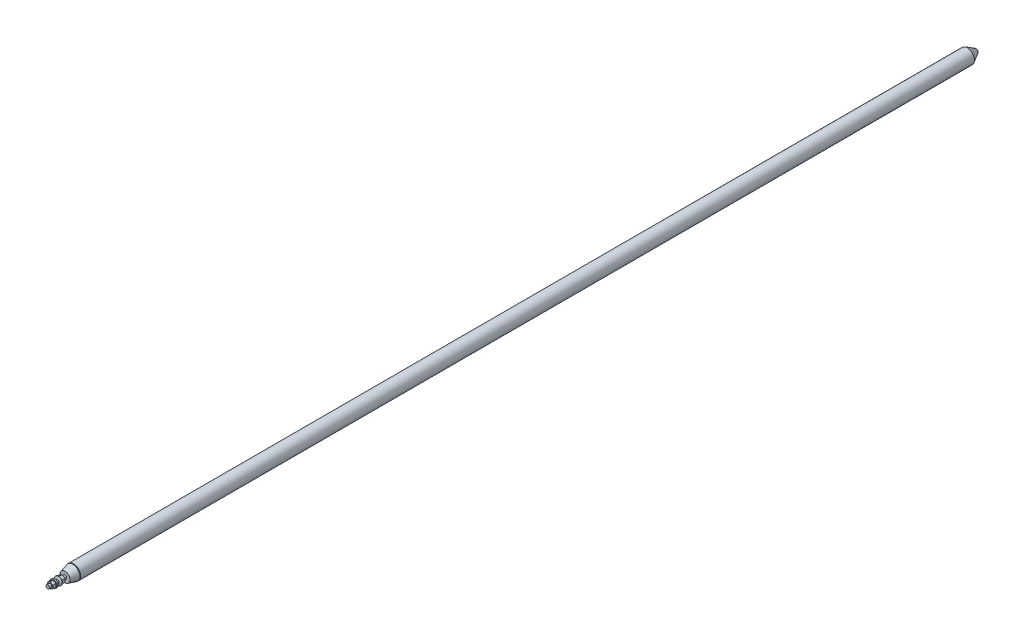
ISO-10303-21;
HEADER;
FILE_DESCRIPTION(('STEP AP214'),'2;1');
FILE_NAME('part.step','',(''),(''),'','','');
FILE_SCHEMA(('AUTOMOTIVE_DESIGN { 1 0 10303 214 1 1 1 1 }'));
ENDSEC;
DATA;
#1=APPLICATION_CONTEXT('core data for automotive mechanical design processes');
#2=APPLICATION_PROTOCOL_DEFINITION('international standard','automotive_design',2000,#1);
#3=PRODUCT_CONTEXT('',#1,'mechanical');
#4=PRODUCT('Part','Part','',(#3));
#5=PRODUCT_RELATED_PRODUCT_CATEGORY('part','',(#4));
#6=PRODUCT_DEFINITION_FORMATION('','',#4);
#7=PRODUCT_DEFINITION_CONTEXT('part definition',#1,'design');
#8=PRODUCT_DEFINITION('design','',#6,#7);
#9=PRODUCT_DEFINITION_SHAPE('','',#8);
#10=(LENGTH_UNIT() NAMED_UNIT(*) SI_UNIT(.MILLI.,.METRE.));
#11=(NAMED_UNIT(*) PLANE_ANGLE_UNIT() SI_UNIT($,.RADIAN.));
#12=(NAMED_UNIT(*) SI_UNIT($,.STERADIAN.) SOLID_ANGLE_UNIT());
#13=UNCERTAINTY_MEASURE_WITH_UNIT(LENGTH_MEASURE(1.E-05),#10,'distance_accuracy_value','');
#14=(GEOMETRIC_REPRESENTATION_CONTEXT(3) GLOBAL_UNCERTAINTY_ASSIGNED_CONTEXT((#13)) GLOBAL_UNIT_ASSIGNED_CONTEXT((#10,
#11,#12)) REPRESENTATION_CONTEXT('',''));
#15=CARTESIAN_POINT('',(0.,0.,0.));
#16=DIRECTION('',(0.,0.,1.));
#17=DIRECTION('',(1.,0.,0.));
#18=AXIS2_PLACEMENT_3D('',#15,#16,#17);
#19=CARTESIAN_POINT('',(0.,16.6751,52.1089983991226));
#20=DIRECTION('',(0.,0.,1.));
#21=DIRECTION('',(1.,0.,0.));
#22=AXIS2_PLACEMENT_3D('',#19,#20,#21);
#23=PLANE('',#22);
#24=CARTESIAN_POINT('',(0.,0.,52.1089983991226));
#25=DIRECTION('',(0.,0.,-1.));
#26=DIRECTION('',(-1.,0.,0.));
#27=AXIS2_PLACEMENT_3D('',#24,#25,#26);
#28=CIRCLE('',#27,16.6751);
#29=CARTESIAN_POINT('',(-16.6751,0.,52.1089983991226));
#30=VERTEX_POINT('',#29);
#31=EDGE_CURVE('E149',#30,#30,#28,.T.);
#32=ORIENTED_EDGE('',*,*,#31,.F.);
#33=EDGE_LOOP('',(#32));
#34=FACE_BOUND('',#33,.T.);
#35=DIRECTION('',(0.866025403784438,0.5,0.));
#36=VECTOR('',#35,1.);
#37=CARTESIAN_POINT('',(0.,-13.7554856334967,52.1089983991226));
#38=LINE('',#37,#36);
#39=CARTESIAN_POINT('',(0.,-13.7554856334967,52.1089983991226));
#40=VERTEX_POINT('',#39);
#41=CARTESIAN_POINT('',(11.9126,-6.87774281674833,52.1089983991226));
#42=VERTEX_POINT('',#41);
#43=EDGE_CURVE('E626',#40,#42,#38,.T.);
#44=ORIENTED_EDGE('',*,*,#43,.F.);
#45=DIRECTION('',(0.866025403784439,-0.499999999999999,0.));
#46=VECTOR('',#45,1.);
#47=CARTESIAN_POINT('',(-11.9126,-6.87774281674834,52.1089983991226));
#48=LINE('',#47,#46);
#49=CARTESIAN_POINT('',(-11.9126,-6.87774281674834,52.1089983991226));
#50=VERTEX_POINT('',#49);
#51=EDGE_CURVE('E147',#50,#40,#48,.T.);
#52=ORIENTED_EDGE('',*,*,#51,.F.);
#53=DIRECTION('',(0.,-1.,0.));
#54=VECTOR('',#53,1.);
#55=CARTESIAN_POINT('',(-11.9126,6.87774281674833,52.1089983991226));
#56=LINE('',#55,#54);
#57=CARTESIAN_POINT('',(-11.9126,6.87774281674833,52.1089983991226));
#58=VERTEX_POINT('',#57);
#59=EDGE_CURVE('E143',#58,#50,#56,.T.);
#60=ORIENTED_EDGE('',*,*,#59,.F.);
#61=DIRECTION('',(-0.866025403784439,-0.5,0.));
#62=VECTOR('',#61,1.);
#63=CARTESIAN_POINT('',(0.,13.7554856334967,52.1089983991226));
#64=LINE('',#63,#62);
#65=CARTESIAN_POINT('',(0.,13.7554856334967,52.1089983991226));
#66=VERTEX_POINT('',#65);
#67=EDGE_CURVE('E622',#66,#58,#64,.T.);
#68=ORIENTED_EDGE('',*,*,#67,.F.);
#69=DIRECTION('',(-0.866025403784439,0.5,0.));
#70=VECTOR('',#69,1.);
#71=CARTESIAN_POINT('',(11.9126,6.87774281674833,52.1089983991226));
#72=LINE('',#71,#70);
#73=CARTESIAN_POINT('',(11.9126,6.87774281674833,52.1089983991226));
#74=VERTEX_POINT('',#73);
#75=EDGE_CURVE('E634',#74,#66,#72,.T.);
#76=ORIENTED_EDGE('',*,*,#75,.F.);
#77=DIRECTION('',(0.,1.,0.));
#78=VECTOR('',#77,1.);
#79=CARTESIAN_POINT('',(11.9126,-6.87774281674833,52.1089983991226));
#80=LINE('',#79,#78);
#81=EDGE_CURVE('E628',#42,#74,#80,.T.);
#82=ORIENTED_EDGE('',*,*,#81,.F.);
#83=EDGE_LOOP('',(#44,#52,#60,#68,#76,#82));
#84=FACE_BOUND('',#83,.T.);
#85=ADVANCED_FACE('F33',(#34,#84),#23,.T.);
#86=CARTESIAN_POINT('',(0.,0.,0.));
#87=DIRECTION('',(0.,0.,-1.));
#88=DIRECTION('',(-1.,0.,0.));
#89=AXIS2_PLACEMENT_3D('',#86,#87,#88);
#90=CYLINDRICAL_SURFACE('',#89,7.93749999999999);
#91=CARTESIAN_POINT('',(0.,0.,46.2923983991226));
#92=DIRECTION('',(0.,0.,-1.));
#93=DIRECTION('',(-1.,0.,0.));
#94=AXIS2_PLACEMENT_3D('',#91,#92,#93);
#95=CIRCLE('',#94,7.93749999999999);
#96=CARTESIAN_POINT('',(-7.93749999999999,0.,46.2923983991226));
#97=VERTEX_POINT('',#96);
#98=EDGE_CURVE('E42',#97,#97,#95,.F.);
#99=ORIENTED_EDGE('',*,*,#98,.F.);
#100=EDGE_LOOP('',(#99));
#101=FACE_BOUND('',#100,.T.);
#102=CARTESIAN_POINT('',(0.,0.,33.5923983991226));
#103=DIRECTION('',(0.,0.,-1.));
#104=DIRECTION('',(-1.,0.,0.));
#105=AXIS2_PLACEMENT_3D('',#102,#103,#104);
#106=CIRCLE('',#105,7.93749999999999);
#107=CARTESIAN_POINT('',(0.,7.93749999999996,33.5923983991227));
#108=VERTEX_POINT('',#107);
#109=EDGE_CURVE('E236',#108,#108,#106,.T.);
#110=ORIENTED_EDGE('',*,*,#109,.F.);
#111=EDGE_LOOP('',(#110));
#112=FACE_BOUND('',#111,.T.);
#113=ADVANCED_FACE('F248',(#101,#112),#90,.T.);
#114=CARTESIAN_POINT('',(0.,0.,0.));
#115=DIRECTION('',(0.,0.,-1.));
#116=DIRECTION('',(-1.,0.,0.));
#117=AXIS2_PLACEMENT_3D('',#114,#115,#116);
#118=CIRCLE('',#117,7.93749999999999);
#119=CARTESIAN_POINT('',(-7.93749999999999,0.,0.));
#120=VERTEX_POINT('',#119);
#121=EDGE_CURVE('E224',#120,#120,#118,.T.);
#122=ORIENTED_EDGE('',*,*,#121,.F.);
#123=EDGE_LOOP('',(#122));
#124=FACE_BOUND('',#123,.T.);
#125=CARTESIAN_POINT('',(0.,0.,12.690475));
#126=DIRECTION('',(0.,0.,1.));
#127=DIRECTION('',(1.,0.,0.));
#128=AXIS2_PLACEMENT_3D('',#125,#126,#127);
#129=CIRCLE('',#128,7.93749999999999);
#130=CARTESIAN_POINT('',(7.93749999999999,0.,12.690475));
#131=VERTEX_POINT('',#130);
#132=EDGE_CURVE('E201',#131,#131,#129,.F.);
#133=ORIENTED_EDGE('',*,*,#132,.T.);
#134=EDGE_LOOP('',(#133));
#135=FACE_BOUND('',#134,.T.);
#136=ADVANCED_FACE('F251',(#124,#135),#90,.T.);
#137=CARTESIAN_POINT('',(0.,0.,-38.1));
#138=DIRECTION('',(0.,0.,1.));
#139=DIRECTION('',(1.,0.,0.));
#140=AXIS2_PLACEMENT_3D('',#137,#138,#139);
#141=CONICAL_SURFACE('',#140,28.575,0.780728808749583);
#142=CARTESIAN_POINT('',(0.,0.,-34.8952102827305));
#143=DIRECTION('',(0.,0.,-1.));
#144=DIRECTION('',(-1.,0.,0.));
#145=AXIS2_PLACEMENT_3D('',#142,#143,#144);
#146=CIRCLE('',#145,31.75);
#147=CARTESIAN_POINT('',(-31.75,0.,-34.8952102827305));
#148=VERTEX_POINT('',#147);
#149=EDGE_CURVE('E230',#148,#148,#146,.T.);
#150=ORIENTED_EDGE('',*,*,#149,.T.);
#151=EDGE_LOOP('',(#150));
#152=FACE_BOUND('',#151,.T.);
#153=CARTESIAN_POINT('',(0.,0.,-38.1));
#154=DIRECTION('',(0.,0.,-1.));
#155=DIRECTION('',(-1.,0.,0.));
#156=AXIS2_PLACEMENT_3D('',#153,#154,#155);
#157=CIRCLE('',#156,28.575);
#158=CARTESIAN_POINT('',(-28.575,0.,-38.1));
#159=VERTEX_POINT('',#158);
#160=EDGE_CURVE('E233',#159,#159,#157,.T.);
#161=ORIENTED_EDGE('',*,*,#160,.F.);
#162=EDGE_LOOP('',(#161));
#163=FACE_BOUND('',#162,.T.);
#164=ADVANCED_FACE('F454',(#152,#163),#141,.T.);
#165=CARTESIAN_POINT('',(0.,0.,-34.8952102827305));
#166=DIRECTION('',(0.,0.,-1.));
#167=DIRECTION('',(-1.,0.,0.));
#168=AXIS2_PLACEMENT_3D('',#165,#166,#167);
#169=CONICAL_SURFACE('',#168,31.75,0.266468742447018);
#170=CARTESIAN_POINT('',(0.,0.,0.));
#171=DIRECTION('',(0.,0.,-1.));
#172=DIRECTION('',(-1.,0.,0.));
#173=AXIS2_PLACEMENT_3D('',#170,#171,#172);
#174=CIRCLE('',#173,22.225);
#175=CARTESIAN_POINT('',(-22.225,0.,0.));
#176=VERTEX_POINT('',#175);
#177=EDGE_CURVE('E227',#176,#176,#174,.T.);
#178=ORIENTED_EDGE('',*,*,#177,.T.);
#179=EDGE_LOOP('',(#178));
#180=FACE_BOUND('',#179,.T.);
#181=ORIENTED_EDGE('',*,*,#149,.F.);
#182=EDGE_LOOP('',(#181));
#183=FACE_BOUND('',#182,.T.);
#184=ADVANCED_FACE('F540',(#180,#183),#169,.T.);
#185=CARTESIAN_POINT('',(0.,7.93749999999999,0.));
#186=DIRECTION('',(0.,0.,1.));
#187=DIRECTION('',(1.,0.,0.));
#188=AXIS2_PLACEMENT_3D('',#185,#186,#187);
#189=PLANE('',#188);
#190=ORIENTED_EDGE('',*,*,#121,.T.);
#191=EDGE_LOOP('',(#190));
#192=FACE_BOUND('',#191,.T.);
#193=ORIENTED_EDGE('',*,*,#177,.F.);
#194=EDGE_LOOP('',(#193));
#195=FACE_BOUND('',#194,.T.);
#196=ADVANCED_FACE('F527',(#192,#195),#189,.T.);
#197=CARTESIAN_POINT('',(0.,31.75,-38.1));
#198=DIRECTION('',(0.,0.,-1.));
#199=DIRECTION('',(-1.,0.,0.));
#200=AXIS2_PLACEMENT_3D('',#197,#198,#199);
#201=PLANE('',#200);
#202=ORIENTED_EDGE('',*,*,#160,.T.);
#203=EDGE_LOOP('',(#202));
#204=FACE_BOUND('',#203,.T.);
#205=CARTESIAN_POINT('',(0.,0.,-38.1));
#206=DIRECTION('',(0.,0.,1.));
#207=DIRECTION('',(1.,0.,0.));
#208=AXIS2_PLACEMENT_3D('',#205,#206,#207);
#209=CIRCLE('',#208,31.75);
#210=CARTESIAN_POINT('',(31.75,0.,-38.1));
#211=VERTEX_POINT('',#210);
#212=EDGE_CURVE('E205',#211,#211,#209,.T.);
#213=ORIENTED_EDGE('',*,*,#212,.T.);
#214=EDGE_LOOP('',(#213));
#215=FACE_BOUND('',#214,.T.);
#216=ADVANCED_FACE('F523',(#204,#215),#201,.F.);
#217=CARTESIAN_POINT('',(0.,0.,29.7434));
#218=DIRECTION('',(0.,0.,1.));
#219=DIRECTION('',(1.,0.,0.));
#220=AXIS2_PLACEMENT_3D('',#217,#218,#219);
#221=CYLINDRICAL_SURFACE('',#220,31.75);
#222=ORIENTED_EDGE('',*,*,#212,.F.);
#223=EDGE_LOOP('',(#222));
#224=FACE_BOUND('',#223,.T.);
#225=CARTESIAN_POINT('',(0.,0.,-4008.39458615276));
#226=DIRECTION('',(0.,0.,1.));
#227=DIRECTION('',(1.,0.,0.));
#228=AXIS2_PLACEMENT_3D('',#225,#226,#227);
#229=CIRCLE('',#228,31.75);
#230=CARTESIAN_POINT('',(31.75,0.,-4008.39458615276));
#231=VERTEX_POINT('',#230);
#232=EDGE_CURVE('E208',#231,#231,#229,.T.);
#233=ORIENTED_EDGE('',*,*,#232,.T.);
#234=EDGE_LOOP('',(#233));
#235=FACE_BOUND('',#234,.T.);
#236=ADVANCED_FACE('F526',(#224,#235),#221,.T.);
#237=CARTESIAN_POINT('',(0.,0.,-4044.33719929307));
#238=DIRECTION('',(0.,0.,1.));
#239=DIRECTION('',(1.,0.,0.));
#240=AXIS2_PLACEMENT_3D('',#237,#238,#239);
#241=CONICAL_SURFACE('',#240,10.9985226280625,0.523598775598292);
#242=ORIENTED_EDGE('',*,*,#232,.F.);
#243=EDGE_LOOP('',(#242));
#244=FACE_BOUND('',#243,.T.);
#245=CARTESIAN_POINT('',(0.,0.,-4044.33719929307));
#246=DIRECTION('',(0.,0.,1.));
#247=DIRECTION('',(1.,0.,0.));
#248=AXIS2_PLACEMENT_3D('',#245,#246,#247);
#249=CIRCLE('',#248,10.9985226280625);
#250=CARTESIAN_POINT('',(10.9985226280625,0.,-4044.33719929307));
#251=VERTEX_POINT('',#250);
#252=EDGE_CURVE('E211',#251,#251,#249,.T.);
#253=ORIENTED_EDGE('',*,*,#252,.T.);
#254=EDGE_LOOP('',(#253));
#255=FACE_BOUND('',#254,.T.);
#256=ADVANCED_FACE('F531',(#244,#255),#241,.T.);
#257=CARTESIAN_POINT('',(0.,0.,-4037.98719929307));
#258=DIRECTION('',(0.,0.,1.));
#259=DIRECTION('',(0.,1.,0.));
#260=AXIS2_PLACEMENT_3D('',#257,#258,#259);
#261=SPHERICAL_SURFACE('',#260,12.7);
#262=ORIENTED_EDGE('',*,*,#252,.F.);
#263=EDGE_LOOP('',(#262));
#264=FACE_BOUND('',#263,.T.);
#265=ADVANCED_FACE('F464',(#264),#261,.T.);
#266=CARTESIAN_POINT('',(13.5001,-7.79428636908687,12.690475));
#267=DIRECTION('',(-0.499999999999999,0.866025403784439,0.));
#268=DIRECTION('',(-0.866025403784439,-0.5,0.));
#269=AXIS2_PLACEMENT_3D('',#266,#267,#268);
#270=PLANE('',#269);
#271=DIRECTION('',(-0.866025403784439,-0.499999999999999,0.));
#272=VECTOR('',#271,1.);
#273=CARTESIAN_POINT('',(13.5001,-7.79428636908687,28.1686));
#274=LINE('',#273,#272);
#275=CARTESIAN_POINT('',(13.5001,-7.79428636908687,28.1686));
#276=VERTEX_POINT('',#275);
#277=CARTESIAN_POINT('',(0.,-15.5885727381737,28.1686));
#278=VERTEX_POINT('',#277);
#279=EDGE_CURVE('E160',#276,#278,#274,.T.);
#280=ORIENTED_EDGE('',*,*,#279,.T.);
#281=DIRECTION('',(0.,0.,1.));
#282=VECTOR('',#281,1.);
#283=CARTESIAN_POINT('',(0.,-15.5885727381737,12.690475));
#284=LINE('',#283,#282);
#285=CARTESIAN_POINT('',(0.,-15.5885727381737,12.690475));
#286=VERTEX_POINT('',#285);
#287=EDGE_CURVE('E199',#286,#278,#284,.T.);
#288=ORIENTED_EDGE('',*,*,#287,.F.);
#289=DIRECTION('',(-0.866025403784439,-0.499999999999999,0.));
#290=VECTOR('',#289,1.);
#291=CARTESIAN_POINT('',(13.5001,-7.79428636908687,12.690475));
#292=LINE('',#291,#290);
#293=CARTESIAN_POINT('',(13.5001,-7.79428636908687,12.690475));
#294=VERTEX_POINT('',#293);
#295=EDGE_CURVE('E161',#294,#286,#292,.T.);
#296=ORIENTED_EDGE('',*,*,#295,.F.);
#297=DIRECTION('',(0.,0.,1.));
#298=VECTOR('',#297,1.);
#299=CARTESIAN_POINT('',(13.5001,-7.79428636908687,12.690475));
#300=LINE('',#299,#298);
#301=EDGE_CURVE('E175',#294,#276,#300,.T.);
#302=ORIENTED_EDGE('',*,*,#301,.T.);
#303=EDGE_LOOP('',(#280,#288,#296,#302));
#304=FACE_BOUND('',#303,.T.);
#305=ADVANCED_FACE('F292',(#304),#270,.F.);
#306=CARTESIAN_POINT('',(0.,-15.5885727381737,12.690475));
#307=DIRECTION('',(0.5,0.866025403784438,0.));
#308=DIRECTION('',(-0.866025403784438,0.5,0.));
#309=AXIS2_PLACEMENT_3D('',#306,#307,#308);
#310=PLANE('',#309);
#311=DIRECTION('',(-0.866025403784438,0.5,0.));
#312=VECTOR('',#311,1.);
#313=CARTESIAN_POINT('',(0.,-15.5885727381737,28.1686));
#314=LINE('',#313,#312);
#315=CARTESIAN_POINT('',(-13.5001,-7.79428636908686,28.1686));
#316=VERTEX_POINT('',#315);
#317=EDGE_CURVE('E178',#278,#316,#314,.T.);
#318=ORIENTED_EDGE('',*,*,#317,.T.);
#319=DIRECTION('',(0.,0.,1.));
#320=VECTOR('',#319,1.);
#321=CARTESIAN_POINT('',(-13.5001,-7.79428636908686,12.690475));
#322=LINE('',#321,#320);
#323=CARTESIAN_POINT('',(-13.5001,-7.79428636908686,12.690475));
#324=VERTEX_POINT('',#323);
#325=EDGE_CURVE('E196',#324,#316,#322,.T.);
#326=ORIENTED_EDGE('',*,*,#325,.F.);
#327=DIRECTION('',(-0.866025403784438,0.5,0.));
#328=VECTOR('',#327,1.);
#329=CARTESIAN_POINT('',(0.,-15.5885727381737,12.690475));
#330=LINE('',#329,#328);
#331=EDGE_CURVE('E164',#286,#324,#330,.T.);
#332=ORIENTED_EDGE('',*,*,#331,.F.);
#333=ORIENTED_EDGE('',*,*,#287,.T.);
#334=EDGE_LOOP('',(#318,#326,#332,#333));
#335=FACE_BOUND('',#334,.T.);
#336=ADVANCED_FACE('F280',(#335),#310,.F.);
#337=CARTESIAN_POINT('',(-13.5001,-7.79428636908686,12.690475));
#338=DIRECTION('',(1.,0.,0.));
#339=DIRECTION('',(0.,1.,0.));
#340=AXIS2_PLACEMENT_3D('',#337,#338,#339);
#341=PLANE('',#340);
#342=DIRECTION('',(0.,1.,0.));
#343=VECTOR('',#342,1.);
#344=CARTESIAN_POINT('',(-13.5001,-7.79428636908686,28.1686));
#345=LINE('',#344,#343);
#346=CARTESIAN_POINT('',(-13.5001,7.79428636908686,28.1686));
#347=VERTEX_POINT('',#346);
#348=EDGE_CURVE('E180',#316,#347,#345,.T.);
#349=ORIENTED_EDGE('',*,*,#348,.T.);
#350=DIRECTION('',(0.,0.,1.));
#351=VECTOR('',#350,1.);
#352=CARTESIAN_POINT('',(-13.5001,7.79428636908686,12.690475));
#353=LINE('',#352,#351);
#354=CARTESIAN_POINT('',(-13.5001,7.79428636908686,12.690475));
#355=VERTEX_POINT('',#354);
#356=EDGE_CURVE('E193',#355,#347,#353,.T.);
#357=ORIENTED_EDGE('',*,*,#356,.F.);
#358=DIRECTION('',(0.,1.,0.));
#359=VECTOR('',#358,1.);
#360=CARTESIAN_POINT('',(-13.5001,-7.79428636908686,12.690475));
#361=LINE('',#360,#359);
#362=EDGE_CURVE('E167',#324,#355,#361,.T.);
#363=ORIENTED_EDGE('',*,*,#362,.F.);
#364=ORIENTED_EDGE('',*,*,#325,.T.);
#365=EDGE_LOOP('',(#349,#357,#363,#364));
#366=FACE_BOUND('',#365,.T.);
#367=ADVANCED_FACE('F284',(#366),#341,.F.);
#368=CARTESIAN_POINT('',(-13.5001,7.79428636908686,12.690475));
#369=DIRECTION('',(0.5,-0.866025403784439,0.));
#370=DIRECTION('',(0.866025403784439,0.5,0.));
#371=AXIS2_PLACEMENT_3D('',#368,#369,#370);
#372=PLANE('',#371);
#373=DIRECTION('',(0.866025403784439,0.5,0.));
#374=VECTOR('',#373,1.);
#375=CARTESIAN_POINT('',(-13.5001,7.79428636908686,28.1686));
#376=LINE('',#375,#374);
#377=CARTESIAN_POINT('',(0.,15.5885727381737,28.1686));
#378=VERTEX_POINT('',#377);
#379=EDGE_CURVE('E182',#347,#378,#376,.T.);
#380=ORIENTED_EDGE('',*,*,#379,.T.);
#381=DIRECTION('',(0.,0.,1.));
#382=VECTOR('',#381,1.);
#383=CARTESIAN_POINT('',(0.,15.5885727381737,12.690475));
#384=LINE('',#383,#382);
#385=CARTESIAN_POINT('',(0.,15.5885727381737,12.690475));
#386=VERTEX_POINT('',#385);
#387=EDGE_CURVE('E190',#386,#378,#384,.T.);
#388=ORIENTED_EDGE('',*,*,#387,.F.);
#389=DIRECTION('',(0.866025403784439,0.5,0.));
#390=VECTOR('',#389,1.);
#391=CARTESIAN_POINT('',(-13.5001,7.79428636908686,12.690475));
#392=LINE('',#391,#390);
#393=EDGE_CURVE('E169',#355,#386,#392,.T.);
#394=ORIENTED_EDGE('',*,*,#393,.F.);
#395=ORIENTED_EDGE('',*,*,#356,.T.);
#396=EDGE_LOOP('',(#380,#388,#394,#395));
#397=FACE_BOUND('',#396,.T.);
#398=ADVANCED_FACE('F299',(#397),#372,.F.);
#399=CARTESIAN_POINT('',(0.,15.5885727381737,12.690475));
#400=DIRECTION('',(-0.5,-0.866025403784438,0.));
#401=DIRECTION('',(0.866025403784439,-0.5,0.));
#402=AXIS2_PLACEMENT_3D('',#399,#400,#401);
#403=PLANE('',#402);
#404=DIRECTION('',(0.866025403784438,-0.5,0.));
#405=VECTOR('',#404,1.);
#406=CARTESIAN_POINT('',(0.,15.5885727381737,28.1686));
#407=LINE('',#406,#405);
#408=CARTESIAN_POINT('',(13.5001,7.79428636908686,28.1686));
#409=VERTEX_POINT('',#408);
#410=EDGE_CURVE('E184',#378,#409,#407,.T.);
#411=ORIENTED_EDGE('',*,*,#410,.T.);
#412=DIRECTION('',(0.,0.,1.));
#413=VECTOR('',#412,1.);
#414=CARTESIAN_POINT('',(13.5001,7.79428636908686,12.690475));
#415=LINE('',#414,#413);
#416=CARTESIAN_POINT('',(13.5001,7.79428636908686,12.690475));
#417=VERTEX_POINT('',#416);
#418=EDGE_CURVE('E57',#417,#409,#415,.T.);
#419=ORIENTED_EDGE('',*,*,#418,.F.);
#420=DIRECTION('',(0.866025403784438,-0.5,0.));
#421=VECTOR('',#420,1.);
#422=CARTESIAN_POINT('',(0.,15.5885727381737,12.690475));
#423=LINE('',#422,#421);
#424=EDGE_CURVE('E171',#386,#417,#423,.T.);
#425=ORIENTED_EDGE('',*,*,#424,.F.);
#426=ORIENTED_EDGE('',*,*,#387,.T.);
#427=EDGE_LOOP('',(#411,#419,#425,#426));
#428=FACE_BOUND('',#427,.T.);
#429=ADVANCED_FACE('F296',(#428),#403,.F.);
#430=CARTESIAN_POINT('',(13.5001,7.79428636908686,12.690475));
#431=DIRECTION('',(-1.,0.,0.));
#432=DIRECTION('',(0.,0.,1.));
#433=AXIS2_PLACEMENT_3D('',#430,#431,#432);
#434=PLANE('',#433);
#435=DIRECTION('',(0.,-1.,0.));
#436=VECTOR('',#435,1.);
#437=CARTESIAN_POINT('',(13.5001,7.79428636908686,28.1686));
#438=LINE('',#437,#436);
#439=EDGE_CURVE('E165',#409,#276,#438,.T.);
#440=ORIENTED_EDGE('',*,*,#439,.T.);
#441=ORIENTED_EDGE('',*,*,#301,.F.);
#442=DIRECTION('',(0.,-1.,0.));
#443=VECTOR('',#442,1.);
#444=CARTESIAN_POINT('',(13.5001,7.79428636908686,12.690475));
#445=LINE('',#444,#443);
#446=EDGE_CURVE('E173',#417,#294,#445,.T.);
#447=ORIENTED_EDGE('',*,*,#446,.F.);
#448=ORIENTED_EDGE('',*,*,#418,.T.);
#449=EDGE_LOOP('',(#440,#441,#447,#448));
#450=FACE_BOUND('',#449,.T.);
#451=ADVANCED_FACE('F293',(#450),#434,.F.);
#452=CARTESIAN_POINT('',(13.5001,-7.79428636908687,12.690475));
#453=DIRECTION('',(0.,0.,1.));
#454=DIRECTION('',(1.,0.,0.));
#455=AXIS2_PLACEMENT_3D('',#452,#453,#454);
#456=PLANE('',#455);
#457=ORIENTED_EDGE('',*,*,#132,.F.);
#458=EDGE_LOOP('',(#457));
#459=FACE_BOUND('',#458,.T.);
#460=ORIENTED_EDGE('',*,*,#295,.T.);
#461=ORIENTED_EDGE('',*,*,#331,.T.);
#462=ORIENTED_EDGE('',*,*,#362,.T.);
#463=ORIENTED_EDGE('',*,*,#393,.T.);
#464=ORIENTED_EDGE('',*,*,#424,.T.);
#465=ORIENTED_EDGE('',*,*,#446,.T.);
#466=EDGE_LOOP('',(#460,#461,#462,#463,#464,#465));
#467=FACE_BOUND('',#466,.T.);
#468=ADVANCED_FACE('F260',(#459,#467),#456,.F.);
#469=CARTESIAN_POINT('',(0.,0.,0.0435161764705885));
#470=DIRECTION('',(0.,0.,-1.));
#471=DIRECTION('',(0.,1.,0.));
#472=AXIS2_PLACEMENT_3D('',#469,#470,#471);
#473=SPHERICAL_SURFACE('',#472,34.4750838235294);
#474=CARTESIAN_POINT('',(0.,0.,29.7688));
#475=DIRECTION('',(0.,0.,-1.));
#476=DIRECTION('',(-1.,0.,0.));
#477=AXIS2_PLACEMENT_3D('',#474,#475,#476);
#478=CIRCLE('',#477,17.4625);
#479=CARTESIAN_POINT('',(0.,17.4625,29.7688));
#480=VERTEX_POINT('',#479);
#481=EDGE_CURVE('E215',#480,#480,#478,.T.);
#482=CARTESIAN_POINT('',(0.,7.93749999999996,33.5923983991227));
#483=CARTESIAN_POINT('',(0.,8.04193033230631,33.5676907138939));
#484=CARTESIAN_POINT('',(0.,8.14624529277318,33.5424953955937));
#485=CARTESIAN_POINT('',(0.,8.35463538983752,33.4911317569022));
#486=CARTESIAN_POINT('',(0.,8.458710526435,33.464963436511));
#487=CARTESIAN_POINT('',(0.,8.66661189557016,33.4116560576896));
#488=CARTESIAN_POINT('',(0.,8.77043812810784,33.3845169992594));
#489=CARTESIAN_POINT('',(0.,8.97783263624223,33.3292705157999));
#490=CARTESIAN_POINT('',(0.,9.08140091183892,33.3011630907704));
#491=CARTESIAN_POINT('',(0.,9.28827047420351,33.2439823239056));
#492=CARTESIAN_POINT('',(0.,9.39157176097139,33.2149089820701));
#493=CARTESIAN_POINT('',(0.,9.59789833747534,33.1557989172506));
#494=CARTESIAN_POINT('',(0.,9.7009236272114,33.1257621942665));
#495=CARTESIAN_POINT('',(0.,9.90668922540895,33.0647279863804));
#496=CARTESIAN_POINT('',(0.,10.0094295338704,33.0337305014784));
#497=CARTESIAN_POINT('',(0.,10.2146162101565,32.9707774728867));
#498=CARTESIAN_POINT('',(0.,10.3170625779811,32.938821929197));
#499=CARTESIAN_POINT('',(0.,10.521652439256,32.8739555696753));
#500=CARTESIAN_POINT('',(0.,10.6237959327063,32.8410447538433));
#501=CARTESIAN_POINT('',(0.,10.8277711379095,32.7742707199945));
#502=CARTESIAN_POINT('',(0.,10.9296028496623,32.7404075019776));
#503=CARTESIAN_POINT('',(0.,11.132945611335,32.6717316167674));
#504=CARTESIAN_POINT('',(0.,11.234456661255,32.636918949574));
#505=CARTESIAN_POINT('',(0.,11.4371492470899,32.5663472018157));
#506=CARTESIAN_POINT('',(0.,11.5383307830049,32.5305881212508));
#507=CARTESIAN_POINT('',(0.,11.7403555173927,32.458126665085));
#508=CARTESIAN_POINT('',(0.,11.8411987158655,32.4214242894841));
#509=CARTESIAN_POINT('',(0.,12.042537981436,32.3470794438415));
#510=CARTESIAN_POINT('',(0.,12.1430340485337,32.3094369737997));
#511=CARTESIAN_POINT('',(0.,12.3436702876927,32.2332152218499));
#512=CARTESIAN_POINT('',(0.,12.4438104597538,32.194635939942));
#513=CARTESIAN_POINT('',(0.,12.6437261762134,32.1165439285288));
#514=CARTESIAN_POINT('',(0.,12.7435017206118,32.0770311990235));
#515=CARTESIAN_POINT('',(0.,12.9426794809169,31.9970757380846));
#516=CARTESIAN_POINT('',(0.,13.0420816968236,31.956633006651));
#517=CARTESIAN_POINT('',(0.,13.2405041318717,31.8748210686243));
#518=CARTESIAN_POINT('',(0.,13.3395243510132,31.8334518620313));
#519=CARTESIAN_POINT('',(0.,13.5371741575694,31.7497905812473));
#520=CARTESIAN_POINT('',(0.,13.6358037449841,31.7074985070563));
#521=CARTESIAN_POINT('',(0.,13.8326636871895,31.6219951791153));
#522=CARTESIAN_POINT('',(0.,13.9308940419803,31.5787839253653));
#523=CARTESIAN_POINT('',(0.,14.1269469528556,31.4914460065018));
#524=CARTESIAN_POINT('',(0.,14.2247695089402,31.4473193413882));
#525=CARTESIAN_POINT('',(0.,14.4199982918825,31.3581544478201));
#526=CARTESIAN_POINT('',(0.,14.5174045187402,31.3131162193657));
#527=CARTESIAN_POINT('',(0.,14.7117921490136,31.2221321266308));
#528=CARTESIAN_POINT('',(0.,14.8087735524293,31.1761862623503));
#529=CARTESIAN_POINT('',(0.,15.0023030786502,31.0833909046278));
#530=CARTESIAN_POINT('',(0.,15.0988512014553,31.0365414111859));
#531=CARTESIAN_POINT('',(0.,15.2915057470694,30.9419428806036));
#532=CARTESIAN_POINT('',(0.,15.3876121698782,30.8941938434631));
#533=CARTESIAN_POINT('',(0.,15.579374934636,30.7978003893978));
#534=CARTESIAN_POINT('',(0.,15.675031276585,30.749155972473));
#535=CARTESIAN_POINT('',(0.,15.8658855379922,30.6509760008058));
#536=CARTESIAN_POINT('',(0.,15.9610834574505,30.6014404460634));
#537=CARTESIAN_POINT('',(0.,16.1510125722821,30.5014825185434));
#538=CARTESIAN_POINT('',(0.,16.2457437676554,30.4510601457658));
#539=CARTESIAN_POINT('',(0.,16.4347311731984,30.3493329789012));
#540=CARTESIAN_POINT('',(0.,16.5289873833681,30.2980281848143));
#541=CARTESIAN_POINT('',(0.,16.7170165996438,30.194540650465));
#542=CARTESIAN_POINT('',(0.,16.8107896057498,30.1423579102026));
#543=CARTESIAN_POINT('',(0.,16.9978442340481,30.0371190297578));
#544=CARTESIAN_POINT('',(0.,17.0911258562404,29.9840628895754));
#545=CARTESIAN_POINT('',(0.,17.2771895913833,29.877081852009));
#546=CARTESIAN_POINT('',(0.,17.369971704334,29.8231569546252));
#547=CARTESIAN_POINT('',(0.,17.4625,29.7688));
#548=B_SPLINE_CURVE_WITH_KNOTS('',3,(#482,#483,#484,#485,#486,#487,#488,#489,#490,#491,#492,
#493,#494,#495,#496,#497,#498,#499,#500,#501,#502,#503,#504,#505,#506,#507,#508,#509,#510,#511,
#512,#513,#514,#515,#516,#517,#518,#519,#520,#521,#522,#523,#524,#525,#526,#527,#528,#529,#530,
#531,#532,#533,#534,#535,#536,#537,#538,#539,#540,#541,#542,#543,#544,#545,#546,#547),
.UNSPECIFIED.,.F.,.F.,(4,2,2,2,2,2,2,2,2,2,2,2,2,2,2,2,2,2,2,2,2,2,2,2,2,2,2,2,2,2,2,2,4),(0.,
0.321939004572816,0.643878009145632,0.965817013718447,1.28775601829126,1.60969502286408,
1.9316340274369,2.25357303200971,2.57551203658253,2.89745104115534,3.21939004572815,
3.54132905030097,3.86326805487378,4.1852070594466,4.50714606401941,4.82908506859223,
5.15102407316505,5.47296307773786,5.79490208231068,6.11684108688349,6.43878009145631,
6.76071909602913,7.08265810060194,7.40459710517475,7.72653610974757,8.04847511432038,
8.3704141188932,8.69235312346602,9.01429212803883,9.33623113261165,9.65817013718446,
9.98010914175728,10.3020481463301),.UNSPECIFIED.);
#549=EDGE_CURVE('BSEAM256',#108,#480,#548,.T.);
#550=ORIENTED_EDGE('',*,*,#109,.T.);
#551=ORIENTED_EDGE('',*,*,#481,.F.);
#552=ORIENTED_EDGE('',*,*,#549,.T.);
#553=ORIENTED_EDGE('',*,*,#549,.F.);
#554=EDGE_LOOP('',(#550,#552,#551,#553));
#555=FACE_BOUND('',#554,.T.);
#556=ADVANCED_FACE('F256',(#555),#473,.T.);
#557=CARTESIAN_POINT('',(0.,0.,0.));
#558=DIRECTION('',(0.,0.,-1.));
#559=DIRECTION('',(-1.,0.,0.));
#560=AXIS2_PLACEMENT_3D('',#557,#558,#559);
#561=CYLINDRICAL_SURFACE('',#560,17.4625);
#562=ORIENTED_EDGE('',*,*,#481,.T.);
#563=EDGE_LOOP('',(#562));
#564=FACE_BOUND('',#563,.T.);
#565=CARTESIAN_POINT('',(0.,0.,28.1686));
#566=DIRECTION('',(0.,0.,-1.));
#567=DIRECTION('',(-1.,0.,0.));
#568=AXIS2_PLACEMENT_3D('',#565,#566,#567);
#569=CIRCLE('',#568,17.4625);
#570=CARTESIAN_POINT('',(-17.4625,0.,28.1686));
#571=VERTEX_POINT('',#570);
#572=EDGE_CURVE('E218',#571,#571,#569,.T.);
#573=ORIENTED_EDGE('',*,*,#572,.F.);
#574=EDGE_LOOP('',(#573));
#575=FACE_BOUND('',#574,.T.);
#576=ADVANCED_FACE('F259',(#564,#575),#561,.T.);
#577=CARTESIAN_POINT('',(0.,0.,28.1686));
#578=DIRECTION('',(0.,0.,-1.));
#579=DIRECTION('',(-1.,0.,0.));
#580=AXIS2_PLACEMENT_3D('',#577,#578,#579);
#581=PLANE('',#580);
#582=ORIENTED_EDGE('',*,*,#572,.T.);
#583=EDGE_LOOP('',(#582));
#584=FACE_BOUND('',#583,.T.);
#585=ORIENTED_EDGE('',*,*,#317,.F.);
#586=ORIENTED_EDGE('',*,*,#279,.F.);
#587=ORIENTED_EDGE('',*,*,#439,.F.);
#588=ORIENTED_EDGE('',*,*,#410,.F.);
#589=ORIENTED_EDGE('',*,*,#379,.F.);
#590=ORIENTED_EDGE('',*,*,#348,.F.);
#591=EDGE_LOOP('',(#585,#586,#587,#588,#589,#590));
#592=FACE_BOUND('',#591,.T.);
#593=ADVANCED_FACE('F266',(#584,#592),#581,.T.);
#594=CARTESIAN_POINT('',(0.,0.,46.2923983991226));
#595=DIRECTION('',(0.,0.,-1.));
#596=DIRECTION('',(-1.,0.,0.));
#597=AXIS2_PLACEMENT_3D('',#594,#595,#596);
#598=PLANE('',#597);
#599=ORIENTED_EDGE('',*,*,#98,.T.);
#600=EDGE_LOOP('',(#599));
#601=FACE_BOUND('',#600,.T.);
#602=CARTESIAN_POINT('',(0.,0.,46.2923983991226));
#603=DIRECTION('',(0.,0.,-1.));
#604=DIRECTION('',(-1.,0.,0.));
#605=AXIS2_PLACEMENT_3D('',#602,#603,#604);
#606=CIRCLE('',#605,16.6751);
#607=CARTESIAN_POINT('',(-16.6751,0.,46.2923983991226));
#608=VERTEX_POINT('',#607);
#609=EDGE_CURVE('E152',#608,#608,#606,.T.);
#610=ORIENTED_EDGE('',*,*,#609,.T.);
#611=EDGE_LOOP('',(#610));
#612=FACE_BOUND('',#611,.T.);
#613=ADVANCED_FACE('F245',(#601,#612),#598,.T.);
#614=CARTESIAN_POINT('',(0.,0.,0.));
#615=DIRECTION('',(0.,0.,-1.));
#616=DIRECTION('',(-1.,0.,0.));
#617=AXIS2_PLACEMENT_3D('',#614,#615,#616);
#618=CYLINDRICAL_SURFACE('',#617,16.6751);
#619=ORIENTED_EDGE('',*,*,#31,.T.);
#620=EDGE_LOOP('',(#619));
#621=FACE_BOUND('',#620,.T.);
#622=ORIENTED_EDGE('',*,*,#609,.F.);
#623=EDGE_LOOP('',(#622));
#624=FACE_BOUND('',#623,.T.);
#625=ADVANCED_FACE('F318',(#621,#624),#618,.T.);
#626=CARTESIAN_POINT('',(-11.9126,-6.87774281674834,65.9996233991226));
#627=DIRECTION('',(0.499999999999999,0.866025403784439,0.));
#628=DIRECTION('',(-0.866025403784439,0.499999999999999,0.));
#629=AXIS2_PLACEMENT_3D('',#626,#627,#628);
#630=PLANE('',#629);
#631=ORIENTED_EDGE('',*,*,#51,.T.);
#632=DIRECTION('',(0.,0.,-1.));
#633=VECTOR('',#632,1.);
#634=CARTESIAN_POINT('',(0.,-13.7554856334967,65.9996233991226));
#635=LINE('',#634,#633);
#636=CARTESIAN_POINT('',(0.,-13.7554856334967,65.9996233991226));
#637=VERTEX_POINT('',#636);
#638=EDGE_CURVE('E128',#637,#40,#635,.T.);
#639=ORIENTED_EDGE('',*,*,#638,.F.);
#640=DIRECTION('',(0.866025403784439,-0.499999999999999,0.));
#641=VECTOR('',#640,1.);
#642=CARTESIAN_POINT('',(-11.9126,-6.87774281674834,65.9996233991226));
#643=LINE('',#642,#641);
#644=CARTESIAN_POINT('',(-11.9126,-6.87774281674834,65.9996233991226));
#645=VERTEX_POINT('',#644);
#646=EDGE_CURVE('E135',#645,#637,#643,.T.);
#647=ORIENTED_EDGE('',*,*,#646,.F.);
#648=DIRECTION('',(0.,0.,-1.));
#649=VECTOR('',#648,1.);
#650=CARTESIAN_POINT('',(-11.9126,-6.87774281674834,65.9996233991226));
#651=LINE('',#650,#649);
#652=EDGE_CURVE('E620',#645,#50,#651,.T.);
#653=ORIENTED_EDGE('',*,*,#652,.T.);
#654=EDGE_LOOP('',(#631,#639,#647,#653));
#655=FACE_BOUND('',#654,.T.);
#656=ADVANCED_FACE('F145',(#655),#630,.F.);
#657=CARTESIAN_POINT('',(0.,-13.7554856334967,65.9996233991226));
#658=DIRECTION('',(-0.5,0.866025403784438,0.));
#659=DIRECTION('',(-0.866025403784438,-0.5,0.));
#660=AXIS2_PLACEMENT_3D('',#657,#658,#659);
#661=PLANE('',#660);
#662=ORIENTED_EDGE('',*,*,#43,.T.);
#663=DIRECTION('',(0.,0.,-1.));
#664=VECTOR('',#663,1.);
#665=CARTESIAN_POINT('',(11.9126,-6.87774281674833,65.9996233991226));
#666=LINE('',#665,#664);
#667=CARTESIAN_POINT('',(11.9126,-6.87774281674833,65.9996233991226));
#668=VERTEX_POINT('',#667);
#669=EDGE_CURVE('E131',#668,#42,#666,.T.);
#670=ORIENTED_EDGE('',*,*,#669,.F.);
#671=DIRECTION('',(0.866025403784438,0.5,0.));
#672=VECTOR('',#671,1.);
#673=CARTESIAN_POINT('',(0.,-13.7554856334967,65.9996233991226));
#674=LINE('',#673,#672);
#675=EDGE_CURVE('E124',#637,#668,#674,.T.);
#676=ORIENTED_EDGE('',*,*,#675,.F.);
#677=ORIENTED_EDGE('',*,*,#638,.T.);
#678=EDGE_LOOP('',(#662,#670,#676,#677));
#679=FACE_BOUND('',#678,.T.);
#680=ADVANCED_FACE('F126',(#679),#661,.F.);
#681=CARTESIAN_POINT('',(11.9126,-6.87774281674833,65.9996233991226));
#682=DIRECTION('',(-1.,0.,0.));
#683=DIRECTION('',(0.,-1.,0.));
#684=AXIS2_PLACEMENT_3D('',#681,#682,#683);
#685=PLANE('',#684);
#686=ORIENTED_EDGE('',*,*,#81,.T.);
#687=DIRECTION('',(0.,0.,-1.));
#688=VECTOR('',#687,1.);
#689=CARTESIAN_POINT('',(11.9126,6.87774281674833,65.9996233991226));
#690=LINE('',#689,#688);
#691=CARTESIAN_POINT('',(11.9126,6.87774281674833,65.9996233991226));
#692=VERTEX_POINT('',#691);
#693=EDGE_CURVE('E154',#692,#74,#690,.T.);
#694=ORIENTED_EDGE('',*,*,#693,.F.);
#695=DIRECTION('',(0.,1.,0.));
#696=VECTOR('',#695,1.);
#697=CARTESIAN_POINT('',(11.9126,-6.87774281674833,65.9996233991226));
#698=LINE('',#697,#696);
#699=EDGE_CURVE('E134',#668,#692,#698,.T.);
#700=ORIENTED_EDGE('',*,*,#699,.F.);
#701=ORIENTED_EDGE('',*,*,#669,.T.);
#702=EDGE_LOOP('',(#686,#694,#700,#701));
#703=FACE_BOUND('',#702,.T.);
#704=ADVANCED_FACE('F370',(#703),#685,.F.);
#705=CARTESIAN_POINT('',(11.9126,6.87774281674833,65.9996233991226));
#706=DIRECTION('',(-0.5,-0.866025403784439,0.));
#707=DIRECTION('',(0.866025403784439,-0.5,0.));
#708=AXIS2_PLACEMENT_3D('',#705,#706,#707);
#709=PLANE('',#708);
#710=ORIENTED_EDGE('',*,*,#75,.T.);
#711=DIRECTION('',(0.,0.,-1.));
#712=VECTOR('',#711,1.);
#713=CARTESIAN_POINT('',(0.,13.7554856334967,65.9996233991226));
#714=LINE('',#713,#712);
#715=CARTESIAN_POINT('',(0.,13.7554856334967,65.9996233991226));
#716=VERTEX_POINT('',#715);
#717=EDGE_CURVE('E638',#716,#66,#714,.T.);
#718=ORIENTED_EDGE('',*,*,#717,.F.);
#719=DIRECTION('',(-0.866025403784439,0.5,0.));
#720=VECTOR('',#719,1.);
#721=CARTESIAN_POINT('',(11.9126,6.87774281674833,65.9996233991226));
#722=LINE('',#721,#720);
#723=EDGE_CURVE('E645',#692,#716,#722,.T.);
#724=ORIENTED_EDGE('',*,*,#723,.F.);
#725=ORIENTED_EDGE('',*,*,#693,.T.);
#726=EDGE_LOOP('',(#710,#718,#724,#725));
#727=FACE_BOUND('',#726,.T.);
#728=ADVANCED_FACE('F376',(#727),#709,.F.);
#729=CARTESIAN_POINT('',(0.,13.7554856334967,65.9996233991226));
#730=DIRECTION('',(0.5,-0.866025403784439,0.));
#731=DIRECTION('',(0.866025403784439,0.5,0.));
#732=AXIS2_PLACEMENT_3D('',#729,#730,#731);
#733=PLANE('',#732);
#734=ORIENTED_EDGE('',*,*,#67,.T.);
#735=DIRECTION('',(0.,0.,-1.));
#736=VECTOR('',#735,1.);
#737=CARTESIAN_POINT('',(-11.9126,6.87774281674833,65.9996233991226));
#738=LINE('',#737,#736);
#739=CARTESIAN_POINT('',(-11.9126,6.87774281674833,65.9996233991226));
#740=VERTEX_POINT('',#739);
#741=EDGE_CURVE('E49',#740,#58,#738,.T.);
#742=ORIENTED_EDGE('',*,*,#741,.F.);
#743=DIRECTION('',(-0.866025403784439,-0.5,0.));
#744=VECTOR('',#743,1.);
#745=CARTESIAN_POINT('',(0.,13.7554856334967,65.9996233991226));
#746=LINE('',#745,#744);
#747=EDGE_CURVE('E647',#716,#740,#746,.T.);
#748=ORIENTED_EDGE('',*,*,#747,.F.);
#749=ORIENTED_EDGE('',*,*,#717,.T.);
#750=EDGE_LOOP('',(#734,#742,#748,#749));
#751=FACE_BOUND('',#750,.T.);
#752=ADVANCED_FACE('F384',(#751),#733,.F.);
#753=CARTESIAN_POINT('',(-11.9126,6.87774281674833,65.9996233991226));
#754=DIRECTION('',(1.,0.,0.));
#755=DIRECTION('',(0.,1.,0.));
#756=AXIS2_PLACEMENT_3D('',#753,#754,#755);
#757=PLANE('',#756);
#758=ORIENTED_EDGE('',*,*,#59,.T.);
#759=ORIENTED_EDGE('',*,*,#652,.F.);
#760=DIRECTION('',(0.,-1.,0.));
#761=VECTOR('',#760,1.);
#762=CARTESIAN_POINT('',(-11.9126,6.87774281674833,65.9996233991226));
#763=LINE('',#762,#761);
#764=EDGE_CURVE('E139',#740,#645,#763,.T.);
#765=ORIENTED_EDGE('',*,*,#764,.F.);
#766=ORIENTED_EDGE('',*,*,#741,.T.);
#767=EDGE_LOOP('',(#758,#759,#765,#766));
#768=FACE_BOUND('',#767,.T.);
#769=ADVANCED_FACE('F392',(#768),#757,.F.);
#770=CARTESIAN_POINT('',(11.9126,-20.633228450245,65.9996233991226));
#771=DIRECTION('',(0.,0.,1.));
#772=DIRECTION('',(1.,0.,0.));
#773=AXIS2_PLACEMENT_3D('',#770,#771,#772);
#774=PLANE('',#773);
#775=CARTESIAN_POINT('',(0.,0.,65.9996233991226));
#776=DIRECTION('',(0.,0.,1.));
#777=DIRECTION('',(1.,0.,0.));
#778=AXIS2_PLACEMENT_3D('',#775,#776,#777);
#779=CIRCLE('',#778,7.93749999999999);
#780=CARTESIAN_POINT('',(7.93749999999999,0.,65.9996233991226));
#781=VERTEX_POINT('',#780);
#782=EDGE_CURVE('E11',#781,#781,#779,.F.);
#783=ORIENTED_EDGE('',*,*,#782,.T.);
#784=EDGE_LOOP('',(#783));
#785=FACE_BOUND('',#784,.T.);
#786=ORIENTED_EDGE('',*,*,#646,.T.);
#787=ORIENTED_EDGE('',*,*,#675,.T.);
#788=ORIENTED_EDGE('',*,*,#699,.T.);
#789=ORIENTED_EDGE('',*,*,#723,.T.);
#790=ORIENTED_EDGE('',*,*,#747,.T.);
#791=ORIENTED_EDGE('',*,*,#764,.T.);
#792=EDGE_LOOP('',(#786,#787,#788,#789,#790,#791));
#793=FACE_BOUND('',#792,.T.);
#794=ADVANCED_FACE('F138',(#785,#793),#774,.T.);
#795=CARTESIAN_POINT('',(0.,0.,76.2));
#796=DIRECTION('',(0.,0.,1.));
#797=DIRECTION('',(1.,0.,0.));
#798=AXIS2_PLACEMENT_3D('',#795,#796,#797);
#799=PLANE('',#798);
#800=CARTESIAN_POINT('',(0.,0.,76.2));
#801=DIRECTION('',(0.,0.,-1.));
#802=DIRECTION('',(-1.,0.,0.));
#803=AXIS2_PLACEMENT_3D('',#800,#801,#802);
#804=CIRCLE('',#803,7.93749999999999);
#805=CARTESIAN_POINT('',(-7.93749999999999,0.,76.2));
#806=VERTEX_POINT('',#805);
#807=EDGE_CURVE('E221',#806,#806,#804,.T.);
#808=ORIENTED_EDGE('',*,*,#807,.F.);
#809=EDGE_LOOP('',(#808));
#810=FACE_BOUND('',#809,.T.);
#811=ADVANCED_FACE('F406',(#810),#799,.T.);
#812=ORIENTED_EDGE('',*,*,#782,.F.);
#813=EDGE_LOOP('',(#812));
#814=FACE_BOUND('',#813,.T.);
#815=ORIENTED_EDGE('',*,*,#807,.T.);
#816=EDGE_LOOP('',(#815));
#817=FACE_BOUND('',#816,.T.);
#818=ADVANCED_FACE('F253',(#814,#817),#90,.T.);
#819=CLOSED_SHELL('',(#85,#113,#136,#164,#184,#196,#216,#236,#256,#265,#305,#336,#367,#398,#429,
#451,#468,#556,#576,#593,#613,#625,#656,#680,#704,#728,#752,#769,#794,#811,#818));
#820=CARTESIAN_POINT('',(0.,28.575,-47.625));
#821=DIRECTION('',(0.,0.,-1.));
#822=DIRECTION('',(-1.,0.,0.));
#823=AXIS2_PLACEMENT_3D('',#820,#821,#822);
#824=PLANE('',#823);
#825=CARTESIAN_POINT('',(0.,0.,-47.625));
#826=DIRECTION('',(0.,0.,-1.));
#827=DIRECTION('',(-1.,0.,0.));
#828=AXIS2_PLACEMENT_3D('',#825,#826,#827);
#829=CIRCLE('',#828,28.5623);
#830=CARTESIAN_POINT('',(-28.5623,0.,-47.625));
#831=VERTEX_POINT('',#830);
#832=EDGE_CURVE('E214',#831,#831,#829,.T.);
#833=ORIENTED_EDGE('',*,*,#832,.T.);
#834=EDGE_LOOP('',(#833));
#835=FACE_BOUND('',#834,.T.);
#836=ADVANCED_FACE('F35',(#835),#824,.T.);
#837=CARTESIAN_POINT('',(0.,0.,29.7434));
#838=DIRECTION('',(0.,0.,1.));
#839=DIRECTION('',(1.,0.,0.));
#840=AXIS2_PLACEMENT_3D('',#837,#838,#839);
#841=CYLINDRICAL_SURFACE('',#840,28.5623);
#842=ORIENTED_EDGE('',*,*,#832,.F.);
#843=EDGE_LOOP('',(#842));
#844=FACE_BOUND('',#843,.T.);
#845=CARTESIAN_POINT('',(0.,0.,-4008.39458615276));
#846=DIRECTION('',(0.,0.,1.));
#847=DIRECTION('',(1.,0.,0.));
#848=AXIS2_PLACEMENT_3D('',#845,#846,#847);
#849=CIRCLE('',#848,28.5623);
#850=CARTESIAN_POINT('',(28.5623,0.,-4008.39458615276));
#851=VERTEX_POINT('',#850);
#852=EDGE_CURVE('E202',#851,#851,#849,.T.);
#853=ORIENTED_EDGE('',*,*,#852,.F.);
#854=EDGE_LOOP('',(#853));
#855=FACE_BOUND('',#854,.T.);
#856=ADVANCED_FACE('F427',(#844,#855),#841,.F.);
#857=CARTESIAN_POINT('',(0.,28.5623,-4008.39458615276));
#858=DIRECTION('',(0.,0.,-1.));
#859=DIRECTION('',(-1.,0.,0.));
#860=AXIS2_PLACEMENT_3D('',#857,#858,#859);
#861=PLANE('',#860);
#862=ORIENTED_EDGE('',*,*,#852,.T.);
#863=EDGE_LOOP('',(#862));
#864=FACE_BOUND('',#863,.T.);
#865=ADVANCED_FACE('F436',(#864),#861,.F.);
#866=CLOSED_SHELL('',(#836,#856,#865));
#867=ORIENTED_CLOSED_SHELL('',*,#866,.T.);
#868=BREP_WITH_VOIDS('B2',#819,(#867));
#869=ADVANCED_BREP_SHAPE_REPRESENTATION('',(#18,#868),#14);
#870=SHAPE_DEFINITION_REPRESENTATION(#9,#869);
ENDSEC;
END-ISO-10303-21;
